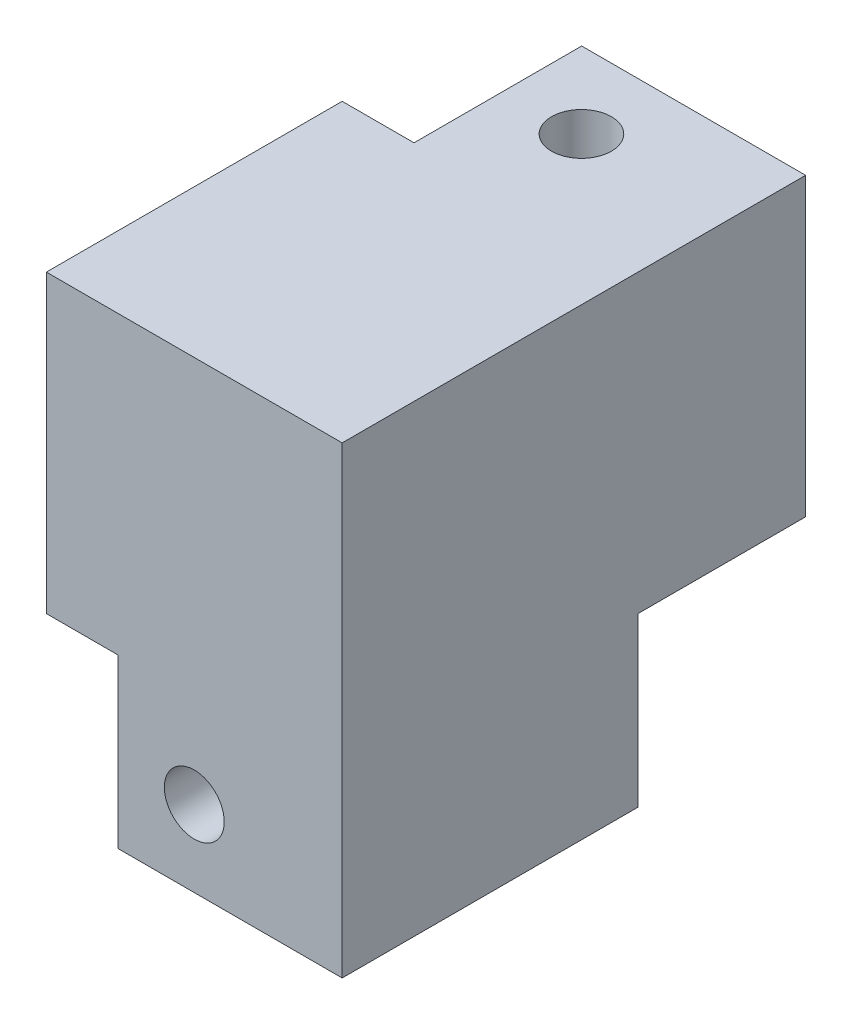
ISO-10303-21;
HEADER;
FILE_DESCRIPTION(('STEP AP214'),'2;1');
FILE_NAME('part.step','',(''),(''),'','','');
FILE_SCHEMA(('AUTOMOTIVE_DESIGN { 1 0 10303 214 1 1 1 1 }'));
ENDSEC;
DATA;
#1=APPLICATION_CONTEXT('core data for automotive mechanical design processes');
#2=APPLICATION_PROTOCOL_DEFINITION('international standard','automotive_design',2000,#1);
#3=PRODUCT_CONTEXT('',#1,'mechanical');
#4=PRODUCT('Part','Part','',(#3));
#5=PRODUCT_RELATED_PRODUCT_CATEGORY('part','',(#4));
#6=PRODUCT_DEFINITION_FORMATION('','',#4);
#7=PRODUCT_DEFINITION_CONTEXT('part definition',#1,'design');
#8=PRODUCT_DEFINITION('design','',#6,#7);
#9=PRODUCT_DEFINITION_SHAPE('','',#8);
#10=(LENGTH_UNIT() NAMED_UNIT(*) SI_UNIT(.MILLI.,.METRE.));
#11=(NAMED_UNIT(*) PLANE_ANGLE_UNIT() SI_UNIT($,.RADIAN.));
#12=(NAMED_UNIT(*) SI_UNIT($,.STERADIAN.) SOLID_ANGLE_UNIT());
#13=UNCERTAINTY_MEASURE_WITH_UNIT(LENGTH_MEASURE(1.E-05),#10,'distance_accuracy_value','');
#14=(GEOMETRIC_REPRESENTATION_CONTEXT(3) GLOBAL_UNCERTAINTY_ASSIGNED_CONTEXT((#13)) GLOBAL_UNIT_ASSIGNED_CONTEXT((#10,
#11,#12)) REPRESENTATION_CONTEXT('',''));
#15=CARTESIAN_POINT('',(0.,0.,0.));
#16=DIRECTION('',(0.,0.,1.));
#17=DIRECTION('',(1.,0.,0.));
#18=AXIS2_PLACEMENT_3D('',#15,#16,#17);
#19=CARTESIAN_POINT('',(0.,24.7,-12.35));
#20=DIRECTION('',(0.,0.,1.));
#21=DIRECTION('',(1.,0.,0.));
#22=AXIS2_PLACEMENT_3D('',#19,#20,#21);
#23=PLANE('',#22);
#24=CARTESIAN_POINT('',(0.,-7.63,-12.35));
#25=DIRECTION('',(0.,0.,1.));
#26=DIRECTION('',(1.,0.,0.));
#27=AXIS2_PLACEMENT_3D('',#24,#25,#26);
#28=CIRCLE('',#27,2.5);
#29=CARTESIAN_POINT('',(2.5,-7.63,-12.35));
#30=VERTEX_POINT('',#29);
#31=EDGE_CURVE('E306',#30,#30,#28,.T.);
#32=ORIENTED_EDGE('',*,*,#31,.T.);
#33=EDGE_LOOP('',(#32));
#34=FACE_BOUND('',#33,.T.);
#35=DIRECTION('',(-1.,0.,0.));
#36=VECTOR('',#35,1.);
#37=CARTESIAN_POINT('',(0.,0.,-12.35));
#38=LINE('',#37,#36);
#39=CARTESIAN_POINT('',(12.35,0.,-12.35));
#40=VERTEX_POINT('',#39);
#41=CARTESIAN_POINT('',(-6.35,0.,-12.35));
#42=VERTEX_POINT('',#41);
#43=EDGE_CURVE('E184',#40,#42,#38,.T.);
#44=ORIENTED_EDGE('',*,*,#43,.F.);
#45=DIRECTION('',(0.,-1.,0.));
#46=VECTOR('',#45,1.);
#47=CARTESIAN_POINT('',(12.35,24.7,-12.35));
#48=LINE('',#47,#46);
#49=CARTESIAN_POINT('',(12.35,-14.,-12.35));
#50=VERTEX_POINT('',#49);
#51=EDGE_CURVE('E289',#40,#50,#48,.T.);
#52=ORIENTED_EDGE('',*,*,#51,.T.);
#53=DIRECTION('',(1.,0.,0.));
#54=VECTOR('',#53,1.);
#55=CARTESIAN_POINT('',(0.,-14.,-12.35));
#56=LINE('',#55,#54);
#57=CARTESIAN_POINT('',(-6.35,-14.,-12.35));
#58=VERTEX_POINT('',#57);
#59=EDGE_CURVE('E201',#58,#50,#56,.T.);
#60=ORIENTED_EDGE('',*,*,#59,.F.);
#61=DIRECTION('',(0.,1.,0.));
#62=VECTOR('',#61,1.);
#63=CARTESIAN_POINT('',(-6.35,-14.,-12.35));
#64=LINE('',#63,#62);
#65=EDGE_CURVE('E257',#58,#42,#64,.T.);
#66=ORIENTED_EDGE('',*,*,#65,.T.);
#67=EDGE_LOOP('',(#44,#52,#60,#66));
#68=FACE_BOUND('',#67,.T.);
#69=ADVANCED_FACE('F40',(#34,#68),#23,.F.);
#70=DIRECTION('',(0.,1.,0.));
#71=VECTOR('',#70,1.);
#72=CARTESIAN_POINT('',(-6.35,0.,-12.35));
#73=LINE('',#72,#71);
#74=CARTESIAN_POINT('',(-6.35,18.7,-12.35));
#75=VERTEX_POINT('',#74);
#76=CARTESIAN_POINT('',(-6.35,24.7,-12.35));
#77=VERTEX_POINT('',#76);
#78=EDGE_CURVE('E58',#75,#77,#73,.T.);
#79=ORIENTED_EDGE('',*,*,#78,.F.);
#80=DIRECTION('',(-1.,0.,0.));
#81=VECTOR('',#80,1.);
#82=CARTESIAN_POINT('',(0.,18.7,-12.35));
#83=LINE('',#82,#81);
#84=CARTESIAN_POINT('',(6.35,18.7,-12.35));
#85=VERTEX_POINT('',#84);
#86=EDGE_CURVE('E62',#85,#75,#83,.T.);
#87=ORIENTED_EDGE('',*,*,#86,.F.);
#88=DIRECTION('',(0.,1.,0.));
#89=VECTOR('',#88,1.);
#90=CARTESIAN_POINT('',(6.35,0.,-12.35));
#91=LINE('',#90,#89);
#92=CARTESIAN_POINT('',(6.35,6.,-12.35));
#93=VERTEX_POINT('',#92);
#94=EDGE_CURVE('E344',#93,#85,#91,.T.);
#95=ORIENTED_EDGE('',*,*,#94,.F.);
#96=DIRECTION('',(-1.,0.,0.));
#97=VECTOR('',#96,1.);
#98=CARTESIAN_POINT('',(0.,6.,-12.35));
#99=LINE('',#98,#97);
#100=CARTESIAN_POINT('',(-6.35,6.,-12.35));
#101=VERTEX_POINT('',#100);
#102=EDGE_CURVE('E341',#93,#101,#99,.T.);
#103=ORIENTED_EDGE('',*,*,#102,.T.);
#104=DIRECTION('',(0.,1.,0.));
#105=VECTOR('',#104,1.);
#106=CARTESIAN_POINT('',(-6.35,0.,-12.35));
#107=LINE('',#106,#105);
#108=EDGE_CURVE('E338',#42,#101,#107,.T.);
#109=ORIENTED_EDGE('',*,*,#108,.F.);
#110=DIRECTION('',(-1.,0.,0.));
#111=VECTOR('',#110,1.);
#112=CARTESIAN_POINT('',(0.,0.,-12.35));
#113=LINE('',#112,#111);
#114=CARTESIAN_POINT('',(-12.35,0.,-12.35));
#115=VERTEX_POINT('',#114);
#116=EDGE_CURVE('E267',#42,#115,#113,.T.);
#117=ORIENTED_EDGE('',*,*,#116,.T.);
#118=DIRECTION('',(0.,-1.,0.));
#119=VECTOR('',#118,1.);
#120=CARTESIAN_POINT('',(-12.35,24.7,-12.35));
#121=LINE('',#120,#119);
#122=CARTESIAN_POINT('',(-12.35,24.7,-12.35));
#123=VERTEX_POINT('',#122);
#124=EDGE_CURVE('E277',#123,#115,#121,.T.);
#125=ORIENTED_EDGE('',*,*,#124,.F.);
#126=DIRECTION('',(-1.,0.,0.));
#127=VECTOR('',#126,1.);
#128=CARTESIAN_POINT('',(0.,24.7,-12.35));
#129=LINE('',#128,#127);
#130=EDGE_CURVE('E274',#77,#123,#129,.T.);
#131=ORIENTED_EDGE('',*,*,#130,.F.);
#132=EDGE_LOOP('',(#79,#87,#95,#103,#109,#117,#125,#131));
#133=FACE_BOUND('',#132,.T.);
#134=ADVANCED_FACE('F373',(#133),#23,.F.);
#135=CARTESIAN_POINT('',(-12.35,24.7,0.));
#136=DIRECTION('',(-1.,0.,0.));
#137=DIRECTION('',(0.,0.,1.));
#138=AXIS2_PLACEMENT_3D('',#135,#136,#137);
#139=PLANE('',#138);
#140=DIRECTION('',(0.,0.,-1.));
#141=VECTOR('',#140,1.);
#142=CARTESIAN_POINT('',(-12.35,0.,0.));
#143=LINE('',#142,#141);
#144=CARTESIAN_POINT('',(-12.35,0.,12.35));
#145=VERTEX_POINT('',#144);
#146=EDGE_CURVE('E261',#145,#115,#143,.T.);
#147=ORIENTED_EDGE('',*,*,#146,.F.);
#148=DIRECTION('',(0.,-1.,0.));
#149=VECTOR('',#148,1.);
#150=CARTESIAN_POINT('',(-12.35,24.7,12.35));
#151=LINE('',#150,#149);
#152=CARTESIAN_POINT('',(-12.35,24.7,12.35));
#153=VERTEX_POINT('',#152);
#154=EDGE_CURVE('E11',#153,#145,#151,.T.);
#155=ORIENTED_EDGE('',*,*,#154,.F.);
#156=DIRECTION('',(0.,0.,-1.));
#157=VECTOR('',#156,1.);
#158=CARTESIAN_POINT('',(-12.35,24.7,0.));
#159=LINE('',#158,#157);
#160=EDGE_CURVE('E262',#153,#123,#159,.T.);
#161=ORIENTED_EDGE('',*,*,#160,.T.);
#162=ORIENTED_EDGE('',*,*,#124,.T.);
#163=EDGE_LOOP('',(#147,#155,#161,#162));
#164=FACE_BOUND('',#163,.T.);
#165=ADVANCED_FACE('F42',(#164),#139,.T.);
#166=CARTESIAN_POINT('',(0.,24.7,12.35));
#167=DIRECTION('',(0.,0.,1.));
#168=DIRECTION('',(1.,0.,0.));
#169=AXIS2_PLACEMENT_3D('',#166,#167,#168);
#170=PLANE('',#169);
#171=CARTESIAN_POINT('',(0.,-7.63,12.35));
#172=DIRECTION('',(0.,0.,1.));
#173=DIRECTION('',(1.,0.,0.));
#174=AXIS2_PLACEMENT_3D('',#171,#172,#173);
#175=CIRCLE('',#174,2.5);
#176=CARTESIAN_POINT('',(2.5,-7.63,12.35));
#177=VERTEX_POINT('',#176);
#178=EDGE_CURVE('E495',#177,#177,#175,.T.);
#179=ORIENTED_EDGE('',*,*,#178,.F.);
#180=EDGE_LOOP('',(#179));
#181=FACE_BOUND('',#180,.T.);
#182=DIRECTION('',(-1.,0.,0.));
#183=VECTOR('',#182,1.);
#184=CARTESIAN_POINT('',(0.,0.,12.35));
#185=LINE('',#184,#183);
#186=CARTESIAN_POINT('',(-6.35,0.,12.35));
#187=VERTEX_POINT('',#186);
#188=EDGE_CURVE('E281',#187,#145,#185,.T.);
#189=ORIENTED_EDGE('',*,*,#188,.F.);
#190=DIRECTION('',(0.,1.,0.));
#191=VECTOR('',#190,1.);
#192=CARTESIAN_POINT('',(-6.35,-14.,12.35));
#193=LINE('',#192,#191);
#194=CARTESIAN_POINT('',(-6.35,-14.,12.35));
#195=VERTEX_POINT('',#194);
#196=EDGE_CURVE('E254',#195,#187,#193,.T.);
#197=ORIENTED_EDGE('',*,*,#196,.F.);
#198=DIRECTION('',(-1.,0.,0.));
#199=VECTOR('',#198,1.);
#200=CARTESIAN_POINT('',(0.,-14.,12.35));
#201=LINE('',#200,#199);
#202=CARTESIAN_POINT('',(12.35,-14.,12.35));
#203=VERTEX_POINT('',#202);
#204=EDGE_CURVE('E210',#203,#195,#201,.T.);
#205=ORIENTED_EDGE('',*,*,#204,.F.);
#206=DIRECTION('',(0.,-1.,0.));
#207=VECTOR('',#206,1.);
#208=CARTESIAN_POINT('',(12.35,24.7,12.35));
#209=LINE('',#208,#207);
#210=CARTESIAN_POINT('',(12.35,24.7,12.35));
#211=VERTEX_POINT('',#210);
#212=EDGE_CURVE('E50',#211,#203,#209,.T.);
#213=ORIENTED_EDGE('',*,*,#212,.F.);
#214=DIRECTION('',(-1.,0.,0.));
#215=VECTOR('',#214,1.);
#216=CARTESIAN_POINT('',(0.,24.7,12.35));
#217=LINE('',#216,#215);
#218=EDGE_CURVE('E266',#211,#153,#217,.T.);
#219=ORIENTED_EDGE('',*,*,#218,.T.);
#220=ORIENTED_EDGE('',*,*,#154,.T.);
#221=EDGE_LOOP('',(#189,#197,#205,#213,#219,#220));
#222=FACE_BOUND('',#221,.T.);
#223=ADVANCED_FACE('F424',(#181,#222),#170,.T.);
#224=CARTESIAN_POINT('',(12.35,24.7,0.));
#225=DIRECTION('',(-1.,0.,0.));
#226=DIRECTION('',(0.,0.,1.));
#227=AXIS2_PLACEMENT_3D('',#224,#225,#226);
#228=PLANE('',#227);
#229=ORIENTED_EDGE('',*,*,#212,.T.);
#230=DIRECTION('',(0.,0.,1.));
#231=VECTOR('',#230,1.);
#232=CARTESIAN_POINT('',(12.35,-14.,0.));
#233=LINE('',#232,#231);
#234=EDGE_CURVE('E206',#50,#203,#233,.T.);
#235=ORIENTED_EDGE('',*,*,#234,.F.);
#236=ORIENTED_EDGE('',*,*,#51,.F.);
#237=DIRECTION('',(0.,0.,1.));
#238=VECTOR('',#237,1.);
#239=CARTESIAN_POINT('',(12.35,0.,-26.35));
#240=LINE('',#239,#238);
#241=CARTESIAN_POINT('',(12.35,0.,-26.35));
#242=VERTEX_POINT('',#241);
#243=EDGE_CURVE('E335',#242,#40,#240,.T.);
#244=ORIENTED_EDGE('',*,*,#243,.F.);
#245=DIRECTION('',(0.,-1.,0.));
#246=VECTOR('',#245,1.);
#247=CARTESIAN_POINT('',(12.35,0.,-26.35));
#248=LINE('',#247,#246);
#249=CARTESIAN_POINT('',(12.35,24.7,-26.35));
#250=VERTEX_POINT('',#249);
#251=EDGE_CURVE('E177',#250,#242,#248,.T.);
#252=ORIENTED_EDGE('',*,*,#251,.F.);
#253=DIRECTION('',(0.,0.,-1.));
#254=VECTOR('',#253,1.);
#255=CARTESIAN_POINT('',(12.35,24.7,0.));
#256=LINE('',#255,#254);
#257=EDGE_CURVE('E271',#211,#250,#256,.T.);
#258=ORIENTED_EDGE('',*,*,#257,.F.);
#259=EDGE_LOOP('',(#229,#235,#236,#244,#252,#258));
#260=FACE_BOUND('',#259,.T.);
#261=ADVANCED_FACE('F401',(#260),#228,.F.);
#262=CARTESIAN_POINT('',(0.,24.7,0.));
#263=DIRECTION('',(0.,1.,0.));
#264=DIRECTION('',(0.,0.,1.));
#265=AXIS2_PLACEMENT_3D('',#262,#263,#264);
#266=PLANE('',#265);
#267=CARTESIAN_POINT('',(0.,24.7,-19.98));
#268=DIRECTION('',(0.,1.,0.));
#269=DIRECTION('',(0.,0.,1.));
#270=AXIS2_PLACEMENT_3D('',#267,#268,#269);
#271=CIRCLE('',#270,2.5);
#272=CARTESIAN_POINT('',(0.,24.7,-17.48));
#273=VERTEX_POINT('',#272);
#274=EDGE_CURVE('E297',#273,#273,#271,.T.);
#275=ORIENTED_EDGE('',*,*,#274,.F.);
#276=EDGE_LOOP('',(#275));
#277=FACE_BOUND('',#276,.T.);
#278=ORIENTED_EDGE('',*,*,#160,.F.);
#279=ORIENTED_EDGE('',*,*,#218,.F.);
#280=ORIENTED_EDGE('',*,*,#257,.T.);
#281=DIRECTION('',(1.,0.,0.));
#282=VECTOR('',#281,1.);
#283=CARTESIAN_POINT('',(0.,24.7,-26.35));
#284=LINE('',#283,#282);
#285=CARTESIAN_POINT('',(-6.35,24.7,-26.35));
#286=VERTEX_POINT('',#285);
#287=EDGE_CURVE('E330',#286,#250,#284,.T.);
#288=ORIENTED_EDGE('',*,*,#287,.F.);
#289=DIRECTION('',(0.,0.,1.));
#290=VECTOR('',#289,1.);
#291=CARTESIAN_POINT('',(-6.35,24.7,-26.35));
#292=LINE('',#291,#290);
#293=EDGE_CURVE('E353',#286,#77,#292,.T.);
#294=ORIENTED_EDGE('',*,*,#293,.T.);
#295=ORIENTED_EDGE('',*,*,#130,.T.);
#296=EDGE_LOOP('',(#278,#279,#280,#288,#294,#295));
#297=FACE_BOUND('',#296,.T.);
#298=ADVANCED_FACE('F397',(#277,#297),#266,.T.);
#299=CARTESIAN_POINT('',(0.,0.,0.));
#300=DIRECTION('',(0.,1.,0.));
#301=DIRECTION('',(0.,0.,1.));
#302=AXIS2_PLACEMENT_3D('',#299,#300,#301);
#303=PLANE('',#302);
#304=ORIENTED_EDGE('',*,*,#116,.F.);
#305=DIRECTION('',(0.,0.,1.));
#306=VECTOR('',#305,1.);
#307=CARTESIAN_POINT('',(-6.35,0.,0.));
#308=LINE('',#307,#306);
#309=CARTESIAN_POINT('',(-6.35,0.,-6.35));
#310=VERTEX_POINT('',#309);
#311=EDGE_CURVE('E186',#42,#310,#308,.T.);
#312=ORIENTED_EDGE('',*,*,#311,.T.);
#313=DIRECTION('',(1.,0.,0.));
#314=VECTOR('',#313,1.);
#315=CARTESIAN_POINT('',(0.,0.,-6.35));
#316=LINE('',#315,#314);
#317=CARTESIAN_POINT('',(6.35,0.,-6.35));
#318=VERTEX_POINT('',#317);
#319=EDGE_CURVE('E202',#310,#318,#316,.T.);
#320=ORIENTED_EDGE('',*,*,#319,.T.);
#321=DIRECTION('',(0.,0.,1.));
#322=VECTOR('',#321,1.);
#323=CARTESIAN_POINT('',(6.35,0.,0.));
#324=LINE('',#323,#322);
#325=CARTESIAN_POINT('',(6.35,0.,6.35));
#326=VERTEX_POINT('',#325);
#327=EDGE_CURVE('E236',#318,#326,#324,.T.);
#328=ORIENTED_EDGE('',*,*,#327,.T.);
#329=DIRECTION('',(1.,0.,0.));
#330=VECTOR('',#329,1.);
#331=CARTESIAN_POINT('',(0.,0.,6.35));
#332=LINE('',#331,#330);
#333=CARTESIAN_POINT('',(-6.35,0.,6.35));
#334=VERTEX_POINT('',#333);
#335=EDGE_CURVE('E232',#334,#326,#332,.T.);
#336=ORIENTED_EDGE('',*,*,#335,.F.);
#337=DIRECTION('',(0.,0.,1.));
#338=VECTOR('',#337,1.);
#339=CARTESIAN_POINT('',(-6.35,0.,0.));
#340=LINE('',#339,#338);
#341=EDGE_CURVE('E191',#334,#187,#340,.T.);
#342=ORIENTED_EDGE('',*,*,#341,.T.);
#343=ORIENTED_EDGE('',*,*,#188,.T.);
#344=ORIENTED_EDGE('',*,*,#146,.T.);
#345=EDGE_LOOP('',(#304,#312,#320,#328,#336,#342,#343,#344));
#346=FACE_BOUND('',#345,.T.);
#347=ADVANCED_FACE('F385',(#346),#303,.F.);
#348=CARTESIAN_POINT('',(-6.35,-14.,0.));
#349=DIRECTION('',(-1.,0.,0.));
#350=DIRECTION('',(0.,0.,1.));
#351=AXIS2_PLACEMENT_3D('',#348,#349,#350);
#352=PLANE('',#351);
#353=ORIENTED_EDGE('',*,*,#311,.F.);
#354=ORIENTED_EDGE('',*,*,#65,.F.);
#355=DIRECTION('',(0.,0.,1.));
#356=VECTOR('',#355,1.);
#357=CARTESIAN_POINT('',(-6.35,-14.,0.));
#358=LINE('',#357,#356);
#359=CARTESIAN_POINT('',(-6.35,-14.,-6.35));
#360=VERTEX_POINT('',#359);
#361=EDGE_CURVE('E197',#58,#360,#358,.T.);
#362=ORIENTED_EDGE('',*,*,#361,.T.);
#363=DIRECTION('',(0.,1.,0.));
#364=VECTOR('',#363,1.);
#365=CARTESIAN_POINT('',(-6.35,-14.,-6.35));
#366=LINE('',#365,#364);
#367=EDGE_CURVE('E227',#360,#310,#366,.T.);
#368=ORIENTED_EDGE('',*,*,#367,.T.);
#369=EDGE_LOOP('',(#353,#354,#362,#368));
#370=FACE_BOUND('',#369,.T.);
#371=ADVANCED_FACE('F382',(#370),#352,.T.);
#372=CARTESIAN_POINT('',(-6.35,-14.,0.));
#373=DIRECTION('',(-1.,0.,0.));
#374=DIRECTION('',(0.,0.,1.));
#375=AXIS2_PLACEMENT_3D('',#372,#373,#374);
#376=PLANE('',#375);
#377=ORIENTED_EDGE('',*,*,#341,.F.);
#378=DIRECTION('',(0.,1.,0.));
#379=VECTOR('',#378,1.);
#380=CARTESIAN_POINT('',(-6.35,-14.,6.35));
#381=LINE('',#380,#379);
#382=CARTESIAN_POINT('',(-6.35,-14.,6.35));
#383=VERTEX_POINT('',#382);
#384=EDGE_CURVE('E251',#383,#334,#381,.T.);
#385=ORIENTED_EDGE('',*,*,#384,.F.);
#386=DIRECTION('',(0.,0.,1.));
#387=VECTOR('',#386,1.);
#388=CARTESIAN_POINT('',(-6.35,-14.,0.));
#389=LINE('',#388,#387);
#390=EDGE_CURVE('E213',#383,#195,#389,.T.);
#391=ORIENTED_EDGE('',*,*,#390,.T.);
#392=ORIENTED_EDGE('',*,*,#196,.T.);
#393=EDGE_LOOP('',(#377,#385,#391,#392));
#394=FACE_BOUND('',#393,.T.);
#395=ADVANCED_FACE('F421',(#394),#376,.T.);
#396=CARTESIAN_POINT('',(0.,-14.,6.35));
#397=DIRECTION('',(0.,0.,1.));
#398=DIRECTION('',(1.,0.,0.));
#399=AXIS2_PLACEMENT_3D('',#396,#397,#398);
#400=PLANE('',#399);
#401=CARTESIAN_POINT('',(0.,-7.63,6.35));
#402=DIRECTION('',(0.,0.,1.));
#403=DIRECTION('',(1.,0.,0.));
#404=AXIS2_PLACEMENT_3D('',#401,#402,#403);
#405=CIRCLE('',#404,2.5);
#406=CARTESIAN_POINT('',(2.5,-7.63,6.35));
#407=VERTEX_POINT('',#406);
#408=EDGE_CURVE('E312',#407,#407,#405,.T.);
#409=ORIENTED_EDGE('',*,*,#408,.T.);
#410=EDGE_LOOP('',(#409));
#411=FACE_BOUND('',#410,.T.);
#412=ORIENTED_EDGE('',*,*,#335,.T.);
#413=DIRECTION('',(0.,1.,0.));
#414=VECTOR('',#413,1.);
#415=CARTESIAN_POINT('',(6.35,-14.,6.35));
#416=LINE('',#415,#414);
#417=CARTESIAN_POINT('',(6.35,-14.,6.35));
#418=VERTEX_POINT('',#417);
#419=EDGE_CURVE('E248',#418,#326,#416,.T.);
#420=ORIENTED_EDGE('',*,*,#419,.F.);
#421=DIRECTION('',(1.,0.,0.));
#422=VECTOR('',#421,1.);
#423=CARTESIAN_POINT('',(0.,-14.,6.35));
#424=LINE('',#423,#422);
#425=EDGE_CURVE('E217',#383,#418,#424,.T.);
#426=ORIENTED_EDGE('',*,*,#425,.F.);
#427=ORIENTED_EDGE('',*,*,#384,.T.);
#428=EDGE_LOOP('',(#412,#420,#426,#427));
#429=FACE_BOUND('',#428,.T.);
#430=ADVANCED_FACE('F417',(#411,#429),#400,.F.);
#431=CARTESIAN_POINT('',(6.35,-14.,0.));
#432=DIRECTION('',(-1.,0.,0.));
#433=DIRECTION('',(0.,0.,1.));
#434=AXIS2_PLACEMENT_3D('',#431,#432,#433);
#435=PLANE('',#434);
#436=ORIENTED_EDGE('',*,*,#327,.F.);
#437=DIRECTION('',(0.,1.,0.));
#438=VECTOR('',#437,1.);
#439=CARTESIAN_POINT('',(6.35,-14.,-6.35));
#440=LINE('',#439,#438);
#441=CARTESIAN_POINT('',(6.35,-14.,-6.35));
#442=VERTEX_POINT('',#441);
#443=EDGE_CURVE('E245',#442,#318,#440,.T.);
#444=ORIENTED_EDGE('',*,*,#443,.F.);
#445=DIRECTION('',(0.,0.,1.));
#446=VECTOR('',#445,1.);
#447=CARTESIAN_POINT('',(6.35,-14.,0.));
#448=LINE('',#447,#446);
#449=EDGE_CURVE('E220',#442,#418,#448,.T.);
#450=ORIENTED_EDGE('',*,*,#449,.T.);
#451=ORIENTED_EDGE('',*,*,#419,.T.);
#452=EDGE_LOOP('',(#436,#444,#450,#451));
#453=FACE_BOUND('',#452,.T.);
#454=ADVANCED_FACE('F413',(#453),#435,.T.);
#455=CARTESIAN_POINT('',(0.,-14.,-6.35));
#456=DIRECTION('',(0.,0.,1.));
#457=DIRECTION('',(1.,0.,0.));
#458=AXIS2_PLACEMENT_3D('',#455,#456,#457);
#459=PLANE('',#458);
#460=CARTESIAN_POINT('',(0.,-7.63,-6.35));
#461=DIRECTION('',(0.,0.,1.));
#462=DIRECTION('',(1.,0.,0.));
#463=AXIS2_PLACEMENT_3D('',#460,#461,#462);
#464=CIRCLE('',#463,2.5);
#465=CARTESIAN_POINT('',(2.5,-7.63,-6.35));
#466=VERTEX_POINT('',#465);
#467=EDGE_CURVE('E44',#466,#466,#464,.T.);
#468=ORIENTED_EDGE('',*,*,#467,.F.);
#469=EDGE_LOOP('',(#468));
#470=FACE_BOUND('',#469,.T.);
#471=ORIENTED_EDGE('',*,*,#319,.F.);
#472=ORIENTED_EDGE('',*,*,#367,.F.);
#473=DIRECTION('',(1.,0.,0.));
#474=VECTOR('',#473,1.);
#475=CARTESIAN_POINT('',(0.,-14.,-6.35));
#476=LINE('',#475,#474);
#477=EDGE_CURVE('E224',#360,#442,#476,.T.);
#478=ORIENTED_EDGE('',*,*,#477,.T.);
#479=ORIENTED_EDGE('',*,*,#443,.T.);
#480=EDGE_LOOP('',(#471,#472,#478,#479));
#481=FACE_BOUND('',#480,.T.);
#482=ADVANCED_FACE('F409',(#470,#481),#459,.T.);
#483=CARTESIAN_POINT('',(0.,-14.,0.));
#484=DIRECTION('',(0.,-1.,0.));
#485=DIRECTION('',(0.,0.,-1.));
#486=AXIS2_PLACEMENT_3D('',#483,#484,#485);
#487=PLANE('',#486);
#488=ORIENTED_EDGE('',*,*,#361,.F.);
#489=ORIENTED_EDGE('',*,*,#59,.T.);
#490=ORIENTED_EDGE('',*,*,#234,.T.);
#491=ORIENTED_EDGE('',*,*,#204,.T.);
#492=ORIENTED_EDGE('',*,*,#390,.F.);
#493=ORIENTED_EDGE('',*,*,#425,.T.);
#494=ORIENTED_EDGE('',*,*,#449,.F.);
#495=ORIENTED_EDGE('',*,*,#477,.F.);
#496=EDGE_LOOP('',(#488,#489,#490,#491,#492,#493,#494,#495));
#497=FACE_BOUND('',#496,.T.);
#498=ADVANCED_FACE('F404',(#497),#487,.T.);
#499=CARTESIAN_POINT('',(0.,0.,-26.35));
#500=DIRECTION('',(0.,1.,0.));
#501=DIRECTION('',(0.,0.,1.));
#502=AXIS2_PLACEMENT_3D('',#499,#500,#501);
#503=PLANE('',#502);
#504=CARTESIAN_POINT('',(0.,0.,-19.98));
#505=DIRECTION('',(0.,1.,0.));
#506=DIRECTION('',(0.,0.,1.));
#507=AXIS2_PLACEMENT_3D('',#504,#505,#506);
#508=CIRCLE('',#507,2.5);
#509=CARTESIAN_POINT('',(0.,0.,-17.48));
#510=VERTEX_POINT('',#509);
#511=EDGE_CURVE('E303',#510,#510,#508,.T.);
#512=ORIENTED_EDGE('',*,*,#511,.T.);
#513=EDGE_LOOP('',(#512));
#514=FACE_BOUND('',#513,.T.);
#515=ORIENTED_EDGE('',*,*,#43,.T.);
#516=DIRECTION('',(0.,0.,1.));
#517=VECTOR('',#516,1.);
#518=CARTESIAN_POINT('',(-6.35,0.,-26.35));
#519=LINE('',#518,#517);
#520=CARTESIAN_POINT('',(-6.35,0.,-26.35));
#521=VERTEX_POINT('',#520);
#522=EDGE_CURVE('E162',#521,#42,#519,.T.);
#523=ORIENTED_EDGE('',*,*,#522,.F.);
#524=DIRECTION('',(-1.,0.,0.));
#525=VECTOR('',#524,1.);
#526=CARTESIAN_POINT('',(0.,0.,-26.35));
#527=LINE('',#526,#525);
#528=EDGE_CURVE('E171',#242,#521,#527,.T.);
#529=ORIENTED_EDGE('',*,*,#528,.F.);
#530=ORIENTED_EDGE('',*,*,#243,.T.);
#531=EDGE_LOOP('',(#515,#523,#529,#530));
#532=FACE_BOUND('',#531,.T.);
#533=ADVANCED_FACE('F183',(#514,#532),#503,.F.);
#534=CARTESIAN_POINT('',(-6.35,0.,-26.35));
#535=DIRECTION('',(1.,0.,0.));
#536=DIRECTION('',(0.,1.,0.));
#537=AXIS2_PLACEMENT_3D('',#534,#535,#536);
#538=PLANE('',#537);
#539=ORIENTED_EDGE('',*,*,#108,.T.);
#540=DIRECTION('',(0.,0.,1.));
#541=VECTOR('',#540,1.);
#542=CARTESIAN_POINT('',(-6.35,6.,-26.35));
#543=LINE('',#542,#541);
#544=CARTESIAN_POINT('',(-6.35,6.,-26.35));
#545=VERTEX_POINT('',#544);
#546=EDGE_CURVE('E165',#545,#101,#543,.T.);
#547=ORIENTED_EDGE('',*,*,#546,.F.);
#548=DIRECTION('',(0.,1.,0.));
#549=VECTOR('',#548,1.);
#550=CARTESIAN_POINT('',(-6.35,0.,-26.35));
#551=LINE('',#550,#549);
#552=EDGE_CURVE('E157',#521,#545,#551,.T.);
#553=ORIENTED_EDGE('',*,*,#552,.F.);
#554=ORIENTED_EDGE('',*,*,#522,.T.);
#555=EDGE_LOOP('',(#539,#547,#553,#554));
#556=FACE_BOUND('',#555,.T.);
#557=ADVANCED_FACE('F160',(#556),#538,.F.);
#558=CARTESIAN_POINT('',(0.,6.,-26.35));
#559=DIRECTION('',(0.,1.,0.));
#560=DIRECTION('',(0.,0.,1.));
#561=AXIS2_PLACEMENT_3D('',#558,#559,#560);
#562=PLANE('',#561);
#563=CARTESIAN_POINT('',(0.,6.,-19.98));
#564=DIRECTION('',(0.,1.,0.));
#565=DIRECTION('',(0.,0.,1.));
#566=AXIS2_PLACEMENT_3D('',#563,#564,#565);
#567=CIRCLE('',#566,2.5);
#568=CARTESIAN_POINT('',(0.,6.,-17.48));
#569=VERTEX_POINT('',#568);
#570=EDGE_CURVE('E296',#569,#569,#567,.T.);
#571=ORIENTED_EDGE('',*,*,#570,.F.);
#572=EDGE_LOOP('',(#571));
#573=FACE_BOUND('',#572,.T.);
#574=ORIENTED_EDGE('',*,*,#102,.F.);
#575=DIRECTION('',(0.,0.,1.));
#576=VECTOR('',#575,1.);
#577=CARTESIAN_POINT('',(6.35,6.,-26.35));
#578=LINE('',#577,#576);
#579=CARTESIAN_POINT('',(6.35,6.,-26.35));
#580=VERTEX_POINT('',#579);
#581=EDGE_CURVE('E193',#580,#93,#578,.T.);
#582=ORIENTED_EDGE('',*,*,#581,.F.);
#583=DIRECTION('',(-1.,0.,0.));
#584=VECTOR('',#583,1.);
#585=CARTESIAN_POINT('',(0.,6.,-26.35));
#586=LINE('',#585,#584);
#587=EDGE_CURVE('E170',#580,#545,#586,.T.);
#588=ORIENTED_EDGE('',*,*,#587,.T.);
#589=ORIENTED_EDGE('',*,*,#546,.T.);
#590=EDGE_LOOP('',(#574,#582,#588,#589));
#591=FACE_BOUND('',#590,.T.);
#592=ADVANCED_FACE('F372',(#573,#591),#562,.T.);
#593=CARTESIAN_POINT('',(6.35,0.,-26.35));
#594=DIRECTION('',(1.,0.,0.));
#595=DIRECTION('',(0.,0.,-1.));
#596=AXIS2_PLACEMENT_3D('',#593,#594,#595);
#597=PLANE('',#596);
#598=ORIENTED_EDGE('',*,*,#94,.T.);
#599=DIRECTION('',(0.,0.,1.));
#600=VECTOR('',#599,1.);
#601=CARTESIAN_POINT('',(6.35,18.7,-26.35));
#602=LINE('',#601,#600);
#603=CARTESIAN_POINT('',(6.35,18.7,-26.35));
#604=VERTEX_POINT('',#603);
#605=EDGE_CURVE('E361',#604,#85,#602,.T.);
#606=ORIENTED_EDGE('',*,*,#605,.F.);
#607=DIRECTION('',(0.,1.,0.));
#608=VECTOR('',#607,1.);
#609=CARTESIAN_POINT('',(6.35,0.,-26.35));
#610=LINE('',#609,#608);
#611=EDGE_CURVE('E321',#580,#604,#610,.T.);
#612=ORIENTED_EDGE('',*,*,#611,.F.);
#613=ORIENTED_EDGE('',*,*,#581,.T.);
#614=EDGE_LOOP('',(#598,#606,#612,#613));
#615=FACE_BOUND('',#614,.T.);
#616=ADVANCED_FACE('F369',(#615),#597,.F.);
#617=CARTESIAN_POINT('',(0.,18.7,-26.35));
#618=DIRECTION('',(0.,1.,0.));
#619=DIRECTION('',(0.,0.,1.));
#620=AXIS2_PLACEMENT_3D('',#617,#618,#619);
#621=PLANE('',#620);
#622=CARTESIAN_POINT('',(0.,18.7,-19.98));
#623=DIRECTION('',(0.,1.,0.));
#624=DIRECTION('',(0.,0.,1.));
#625=AXIS2_PLACEMENT_3D('',#622,#623,#624);
#626=CIRCLE('',#625,2.5);
#627=CARTESIAN_POINT('',(0.,18.7,-17.48));
#628=VERTEX_POINT('',#627);
#629=EDGE_CURVE('E293',#628,#628,#626,.T.);
#630=ORIENTED_EDGE('',*,*,#629,.T.);
#631=EDGE_LOOP('',(#630));
#632=FACE_BOUND('',#631,.T.);
#633=ORIENTED_EDGE('',*,*,#86,.T.);
#634=DIRECTION('',(0.,0.,1.));
#635=VECTOR('',#634,1.);
#636=CARTESIAN_POINT('',(-6.35,18.7,-26.35));
#637=LINE('',#636,#635);
#638=CARTESIAN_POINT('',(-6.35,18.7,-26.35));
#639=VERTEX_POINT('',#638);
#640=EDGE_CURVE('E357',#639,#75,#637,.T.);
#641=ORIENTED_EDGE('',*,*,#640,.F.);
#642=DIRECTION('',(-1.,0.,0.));
#643=VECTOR('',#642,1.);
#644=CARTESIAN_POINT('',(0.,18.7,-26.35));
#645=LINE('',#644,#643);
#646=EDGE_CURVE('E324',#604,#639,#645,.T.);
#647=ORIENTED_EDGE('',*,*,#646,.F.);
#648=ORIENTED_EDGE('',*,*,#605,.T.);
#649=EDGE_LOOP('',(#633,#641,#647,#648));
#650=FACE_BOUND('',#649,.T.);
#651=ADVANCED_FACE('F470',(#632,#650),#621,.F.);
#652=CARTESIAN_POINT('',(-6.35,0.,-26.35));
#653=DIRECTION('',(1.,0.,0.));
#654=DIRECTION('',(0.,1.,0.));
#655=AXIS2_PLACEMENT_3D('',#652,#653,#654);
#656=PLANE('',#655);
#657=ORIENTED_EDGE('',*,*,#78,.T.);
#658=ORIENTED_EDGE('',*,*,#293,.F.);
#659=DIRECTION('',(0.,1.,0.));
#660=VECTOR('',#659,1.);
#661=CARTESIAN_POINT('',(-6.35,0.,-26.35));
#662=LINE('',#661,#660);
#663=EDGE_CURVE('E327',#639,#286,#662,.T.);
#664=ORIENTED_EDGE('',*,*,#663,.F.);
#665=ORIENTED_EDGE('',*,*,#640,.T.);
#666=EDGE_LOOP('',(#657,#658,#664,#665));
#667=FACE_BOUND('',#666,.T.);
#668=ADVANCED_FACE('F393',(#667),#656,.F.);
#669=CARTESIAN_POINT('',(0.,0.,-26.35));
#670=DIRECTION('',(0.,0.,-1.));
#671=DIRECTION('',(-1.,0.,0.));
#672=AXIS2_PLACEMENT_3D('',#669,#670,#671);
#673=PLANE('',#672);
#674=ORIENTED_EDGE('',*,*,#528,.T.);
#675=ORIENTED_EDGE('',*,*,#552,.T.);
#676=ORIENTED_EDGE('',*,*,#587,.F.);
#677=ORIENTED_EDGE('',*,*,#611,.T.);
#678=ORIENTED_EDGE('',*,*,#646,.T.);
#679=ORIENTED_EDGE('',*,*,#663,.T.);
#680=ORIENTED_EDGE('',*,*,#287,.T.);
#681=ORIENTED_EDGE('',*,*,#251,.T.);
#682=EDGE_LOOP('',(#674,#675,#676,#677,#678,#679,#680,#681));
#683=FACE_BOUND('',#682,.T.);
#684=ADVANCED_FACE('F174',(#683),#673,.T.);
#685=CARTESIAN_POINT('',(0.,-14.,-19.98));
#686=DIRECTION('',(0.,1.,0.));
#687=DIRECTION('',(0.,0.,1.));
#688=AXIS2_PLACEMENT_3D('',#685,#686,#687);
#689=CYLINDRICAL_SURFACE('',#688,2.5);
#690=ORIENTED_EDGE('',*,*,#274,.T.);
#691=EDGE_LOOP('',(#690));
#692=FACE_BOUND('',#691,.T.);
#693=ORIENTED_EDGE('',*,*,#629,.F.);
#694=EDGE_LOOP('',(#693));
#695=FACE_BOUND('',#694,.T.);
#696=ADVANCED_FACE('F477',(#692,#695),#689,.F.);
#697=ORIENTED_EDGE('',*,*,#570,.T.);
#698=EDGE_LOOP('',(#697));
#699=FACE_BOUND('',#698,.T.);
#700=ORIENTED_EDGE('',*,*,#511,.F.);
#701=EDGE_LOOP('',(#700));
#702=FACE_BOUND('',#701,.T.);
#703=ADVANCED_FACE('F478',(#699,#702),#689,.F.);
#704=CARTESIAN_POINT('',(0.,-7.63,-26.35));
#705=DIRECTION('',(0.,0.,1.));
#706=DIRECTION('',(1.,0.,0.));
#707=AXIS2_PLACEMENT_3D('',#704,#705,#706);
#708=CYLINDRICAL_SURFACE('',#707,2.5);
#709=ORIENTED_EDGE('',*,*,#467,.T.);
#710=EDGE_LOOP('',(#709));
#711=FACE_BOUND('',#710,.T.);
#712=ORIENTED_EDGE('',*,*,#31,.F.);
#713=EDGE_LOOP('',(#712));
#714=FACE_BOUND('',#713,.T.);
#715=ADVANCED_FACE('F481',(#711,#714),#708,.F.);
#716=ORIENTED_EDGE('',*,*,#178,.T.);
#717=EDGE_LOOP('',(#716));
#718=FACE_BOUND('',#717,.T.);
#719=ORIENTED_EDGE('',*,*,#408,.F.);
#720=EDGE_LOOP('',(#719));
#721=FACE_BOUND('',#720,.T.);
#722=ADVANCED_FACE('F484',(#718,#721),#708,.F.);
#723=CLOSED_SHELL('',(#69,#134,#165,#223,#261,#298,#347,#371,#395,#430,#454,#482,#498,#533,#557,
#592,#616,#651,#668,#684,#696,#703,#715,#722));
#724=MANIFOLD_SOLID_BREP('B2',#723);
#725=ADVANCED_BREP_SHAPE_REPRESENTATION('',(#18,#724),#14);
#726=SHAPE_DEFINITION_REPRESENTATION(#9,#725);
ENDSEC;
END-ISO-10303-21;
